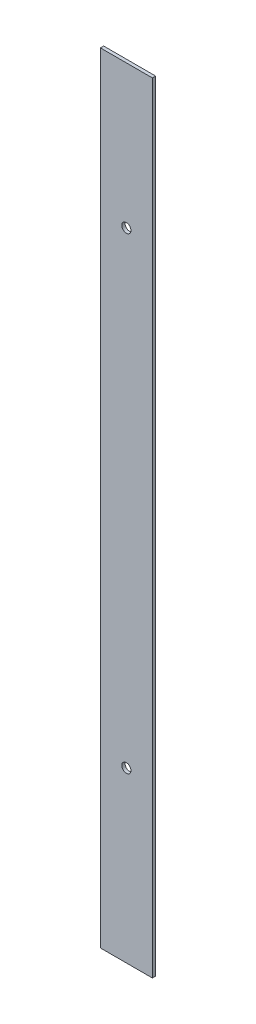
ISO-10303-21;
HEADER;
FILE_DESCRIPTION(('STEP AP214'),'2;1');
FILE_NAME('part.step','',(''),(''),'','','');
FILE_SCHEMA(('AUTOMOTIVE_DESIGN { 1 0 10303 214 1 1 1 1 }'));
ENDSEC;
DATA;
#1=APPLICATION_CONTEXT('core data for automotive mechanical design processes');
#2=APPLICATION_PROTOCOL_DEFINITION('international standard','automotive_design',2000,#1);
#3=PRODUCT_CONTEXT('',#1,'mechanical');
#4=PRODUCT('Part','Part','',(#3));
#5=PRODUCT_RELATED_PRODUCT_CATEGORY('part','',(#4));
#6=PRODUCT_DEFINITION_FORMATION('','',#4);
#7=PRODUCT_DEFINITION_CONTEXT('part definition',#1,'design');
#8=PRODUCT_DEFINITION('design','',#6,#7);
#9=PRODUCT_DEFINITION_SHAPE('','',#8);
#10=(LENGTH_UNIT() NAMED_UNIT(*) SI_UNIT(.MILLI.,.METRE.));
#11=(NAMED_UNIT(*) PLANE_ANGLE_UNIT() SI_UNIT($,.RADIAN.));
#12=(NAMED_UNIT(*) SI_UNIT($,.STERADIAN.) SOLID_ANGLE_UNIT());
#13=UNCERTAINTY_MEASURE_WITH_UNIT(LENGTH_MEASURE(1.E-05),#10,'distance_accuracy_value','');
#14=(GEOMETRIC_REPRESENTATION_CONTEXT(3) GLOBAL_UNCERTAINTY_ASSIGNED_CONTEXT((#13)) GLOBAL_UNIT_ASSIGNED_CONTEXT((#10,
#11,#12)) REPRESENTATION_CONTEXT('',''));
#15=CARTESIAN_POINT('',(0.,0.,0.));
#16=DIRECTION('',(0.,0.,1.));
#17=DIRECTION('',(1.,0.,0.));
#18=AXIS2_PLACEMENT_3D('',#15,#16,#17);
#19=CARTESIAN_POINT('',(0.,0.,1.5875));
#20=DIRECTION('',(0.,0.,-1.));
#21=DIRECTION('',(-1.,0.,0.));
#22=AXIS2_PLACEMENT_3D('',#19,#20,#21);
#23=PLANE('',#22);
#24=DIRECTION('',(0.,-1.,0.));
#25=VECTOR('',#24,1.);
#26=CARTESIAN_POINT('',(0.,0.,1.5875));
#27=LINE('',#26,#25);
#28=CARTESIAN_POINT('',(0.,381.,1.5875));
#29=VERTEX_POINT('',#28);
#30=CARTESIAN_POINT('',(0.,0.,1.5875));
#31=VERTEX_POINT('',#30);
#32=EDGE_CURVE('E92',#29,#31,#27,.T.);
#33=ORIENTED_EDGE('',*,*,#32,.T.);
#34=DIRECTION('',(1.,0.,0.));
#35=VECTOR('',#34,1.);
#36=CARTESIAN_POINT('',(0.,0.,1.5875));
#37=LINE('',#36,#35);
#38=CARTESIAN_POINT('',(25.4,0.,1.5875));
#39=VERTEX_POINT('',#38);
#40=EDGE_CURVE('E87',#31,#39,#37,.T.);
#41=ORIENTED_EDGE('',*,*,#40,.T.);
#42=DIRECTION('',(0.,1.,0.));
#43=VECTOR('',#42,1.);
#44=CARTESIAN_POINT('',(25.4,0.,1.5875));
#45=LINE('',#44,#43);
#46=CARTESIAN_POINT('',(25.4,381.,1.5875));
#47=VERTEX_POINT('',#46);
#48=EDGE_CURVE('E90',#39,#47,#45,.T.);
#49=ORIENTED_EDGE('',*,*,#48,.T.);
#50=DIRECTION('',(-1.,0.,0.));
#51=VECTOR('',#50,1.);
#52=CARTESIAN_POINT('',(0.,381.,1.5875));
#53=LINE('',#52,#51);
#54=EDGE_CURVE('E57',#47,#29,#53,.T.);
#55=ORIENTED_EDGE('',*,*,#54,.T.);
#56=EDGE_LOOP('',(#33,#41,#49,#55));
#57=FACE_BOUND('',#56,.T.);
#58=CARTESIAN_POINT('',(12.7,82.55,1.5875));
#59=DIRECTION('',(0.,0.,1.));
#60=DIRECTION('',(1.,0.,0.));
#61=AXIS2_PLACEMENT_3D('',#58,#59,#60);
#62=CIRCLE('',#61,2.25);
#63=CARTESIAN_POINT('',(14.95,82.55,1.5875));
#64=VERTEX_POINT('',#63);
#65=EDGE_CURVE('E112',#64,#64,#62,.T.);
#66=ORIENTED_EDGE('',*,*,#65,.F.);
#67=EDGE_LOOP('',(#66));
#68=FACE_BOUND('',#67,.T.);
#69=CARTESIAN_POINT('',(12.7,311.15,1.5875));
#70=DIRECTION('',(0.,0.,1.));
#71=DIRECTION('',(1.,0.,0.));
#72=AXIS2_PLACEMENT_3D('',#69,#70,#71);
#73=CIRCLE('',#72,2.25);
#74=CARTESIAN_POINT('',(14.95,311.15,1.5875));
#75=VERTEX_POINT('',#74);
#76=EDGE_CURVE('E134',#75,#75,#73,.T.);
#77=ORIENTED_EDGE('',*,*,#76,.F.);
#78=EDGE_LOOP('',(#77));
#79=FACE_BOUND('',#78,.T.);
#80=ADVANCED_FACE('F39',(#57,#68,#79),#23,.F.);
#81=CARTESIAN_POINT('',(0.,0.,0.));
#82=DIRECTION('',(0.,0.,-1.));
#83=DIRECTION('',(-1.,0.,0.));
#84=AXIS2_PLACEMENT_3D('',#81,#82,#83);
#85=PLANE('',#84);
#86=CARTESIAN_POINT('',(12.7,82.55,0.));
#87=DIRECTION('',(0.,0.,1.));
#88=DIRECTION('',(1.,0.,0.));
#89=AXIS2_PLACEMENT_3D('',#86,#87,#88);
#90=CIRCLE('',#89,2.25);
#91=CARTESIAN_POINT('',(14.95,82.55,0.));
#92=VERTEX_POINT('',#91);
#93=EDGE_CURVE('E130',#92,#92,#90,.T.);
#94=ORIENTED_EDGE('',*,*,#93,.T.);
#95=EDGE_LOOP('',(#94));
#96=FACE_BOUND('',#95,.T.);
#97=DIRECTION('',(0.,-1.,0.));
#98=VECTOR('',#97,1.);
#99=CARTESIAN_POINT('',(0.,0.,0.));
#100=LINE('',#99,#98);
#101=CARTESIAN_POINT('',(0.,381.,0.));
#102=VERTEX_POINT('',#101);
#103=CARTESIAN_POINT('',(0.,0.,0.));
#104=VERTEX_POINT('',#103);
#105=EDGE_CURVE('E108',#102,#104,#100,.T.);
#106=ORIENTED_EDGE('',*,*,#105,.F.);
#107=DIRECTION('',(-1.,0.,0.));
#108=VECTOR('',#107,1.);
#109=CARTESIAN_POINT('',(0.,381.,0.));
#110=LINE('',#109,#108);
#111=CARTESIAN_POINT('',(25.4,381.,0.));
#112=VERTEX_POINT('',#111);
#113=EDGE_CURVE('E80',#112,#102,#110,.T.);
#114=ORIENTED_EDGE('',*,*,#113,.F.);
#115=DIRECTION('',(0.,1.,0.));
#116=VECTOR('',#115,1.);
#117=CARTESIAN_POINT('',(25.4,0.,0.));
#118=LINE('',#117,#116);
#119=CARTESIAN_POINT('',(25.4,0.,0.));
#120=VERTEX_POINT('',#119);
#121=EDGE_CURVE('E74',#120,#112,#118,.T.);
#122=ORIENTED_EDGE('',*,*,#121,.F.);
#123=DIRECTION('',(1.,0.,0.));
#124=VECTOR('',#123,1.);
#125=CARTESIAN_POINT('',(0.,0.,0.));
#126=LINE('',#125,#124);
#127=EDGE_CURVE('E97',#104,#120,#126,.T.);
#128=ORIENTED_EDGE('',*,*,#127,.F.);
#129=EDGE_LOOP('',(#106,#114,#122,#128));
#130=FACE_BOUND('',#129,.T.);
#131=CARTESIAN_POINT('',(12.7,311.15,0.));
#132=DIRECTION('',(0.,0.,1.));
#133=DIRECTION('',(1.,0.,0.));
#134=AXIS2_PLACEMENT_3D('',#131,#132,#133);
#135=CIRCLE('',#134,2.25);
#136=CARTESIAN_POINT('',(14.95,311.15,0.));
#137=VERTEX_POINT('',#136);
#138=EDGE_CURVE('E138',#137,#137,#135,.T.);
#139=ORIENTED_EDGE('',*,*,#138,.T.);
#140=EDGE_LOOP('',(#139));
#141=FACE_BOUND('',#140,.T.);
#142=ADVANCED_FACE('F125',(#96,#130,#141),#85,.T.);
#143=CARTESIAN_POINT('',(0.,0.,1.5875));
#144=DIRECTION('',(1.,0.,0.));
#145=DIRECTION('',(0.,0.,-1.));
#146=AXIS2_PLACEMENT_3D('',#143,#144,#145);
#147=PLANE('',#146);
#148=ORIENTED_EDGE('',*,*,#105,.T.);
#149=DIRECTION('',(0.,0.,-1.));
#150=VECTOR('',#149,1.);
#151=CARTESIAN_POINT('',(0.,0.,1.5875));
#152=LINE('',#151,#150);
#153=EDGE_CURVE('E11',#31,#104,#152,.T.);
#154=ORIENTED_EDGE('',*,*,#153,.F.);
#155=ORIENTED_EDGE('',*,*,#32,.F.);
#156=DIRECTION('',(0.,0.,-1.));
#157=VECTOR('',#156,1.);
#158=CARTESIAN_POINT('',(0.,381.,1.5875));
#159=LINE('',#158,#157);
#160=EDGE_CURVE('E104',#29,#102,#159,.T.);
#161=ORIENTED_EDGE('',*,*,#160,.T.);
#162=EDGE_LOOP('',(#148,#154,#155,#161));
#163=FACE_BOUND('',#162,.T.);
#164=ADVANCED_FACE('F41',(#163),#147,.F.);
#165=CARTESIAN_POINT('',(0.,0.,1.5875));
#166=DIRECTION('',(0.,1.,0.));
#167=DIRECTION('',(0.,0.,1.));
#168=AXIS2_PLACEMENT_3D('',#165,#166,#167);
#169=PLANE('',#168);
#170=ORIENTED_EDGE('',*,*,#127,.T.);
#171=DIRECTION('',(0.,0.,-1.));
#172=VECTOR('',#171,1.);
#173=CARTESIAN_POINT('',(25.4,0.,1.5875));
#174=LINE('',#173,#172);
#175=EDGE_CURVE('E49',#39,#120,#174,.T.);
#176=ORIENTED_EDGE('',*,*,#175,.F.);
#177=ORIENTED_EDGE('',*,*,#40,.F.);
#178=ORIENTED_EDGE('',*,*,#153,.T.);
#179=EDGE_LOOP('',(#170,#176,#177,#178));
#180=FACE_BOUND('',#179,.T.);
#181=ADVANCED_FACE('F96',(#180),#169,.F.);
#182=CARTESIAN_POINT('',(25.4,0.,1.5875));
#183=DIRECTION('',(-1.,0.,0.));
#184=DIRECTION('',(0.,0.,1.));
#185=AXIS2_PLACEMENT_3D('',#182,#183,#184);
#186=PLANE('',#185);
#187=ORIENTED_EDGE('',*,*,#121,.T.);
#188=DIRECTION('',(0.,0.,-1.));
#189=VECTOR('',#188,1.);
#190=CARTESIAN_POINT('',(25.4,381.,1.5875));
#191=LINE('',#190,#189);
#192=EDGE_CURVE('E99',#47,#112,#191,.T.);
#193=ORIENTED_EDGE('',*,*,#192,.F.);
#194=ORIENTED_EDGE('',*,*,#48,.F.);
#195=ORIENTED_EDGE('',*,*,#175,.T.);
#196=EDGE_LOOP('',(#187,#193,#194,#195));
#197=FACE_BOUND('',#196,.T.);
#198=ADVANCED_FACE('F100',(#197),#186,.F.);
#199=CARTESIAN_POINT('',(0.,381.,1.5875));
#200=DIRECTION('',(0.,-1.,0.));
#201=DIRECTION('',(0.,0.,-1.));
#202=AXIS2_PLACEMENT_3D('',#199,#200,#201);
#203=PLANE('',#202);
#204=ORIENTED_EDGE('',*,*,#113,.T.);
#205=ORIENTED_EDGE('',*,*,#160,.F.);
#206=ORIENTED_EDGE('',*,*,#54,.F.);
#207=ORIENTED_EDGE('',*,*,#192,.T.);
#208=EDGE_LOOP('',(#204,#205,#206,#207));
#209=FACE_BOUND('',#208,.T.);
#210=ADVANCED_FACE('F122',(#209),#203,.F.);
#211=CARTESIAN_POINT('',(12.7,82.55,1.5875));
#212=DIRECTION('',(0.,0.,-1.));
#213=DIRECTION('',(-1.,0.,0.));
#214=AXIS2_PLACEMENT_3D('',#211,#212,#213);
#215=CYLINDRICAL_SURFACE('',#214,2.25);
#216=ORIENTED_EDGE('',*,*,#65,.T.);
#217=EDGE_LOOP('',(#216));
#218=FACE_BOUND('',#217,.T.);
#219=ORIENTED_EDGE('',*,*,#93,.F.);
#220=EDGE_LOOP('',(#219));
#221=FACE_BOUND('',#220,.T.);
#222=ADVANCED_FACE('F157',(#218,#221),#215,.F.);
#223=CARTESIAN_POINT('',(12.7,311.15,1.5875));
#224=DIRECTION('',(0.,0.,-1.));
#225=DIRECTION('',(-1.,0.,0.));
#226=AXIS2_PLACEMENT_3D('',#223,#224,#225);
#227=CYLINDRICAL_SURFACE('',#226,2.25);
#228=ORIENTED_EDGE('',*,*,#76,.T.);
#229=EDGE_LOOP('',(#228));
#230=FACE_BOUND('',#229,.T.);
#231=ORIENTED_EDGE('',*,*,#138,.F.);
#232=EDGE_LOOP('',(#231));
#233=FACE_BOUND('',#232,.T.);
#234=ADVANCED_FACE('F146',(#230,#233),#227,.F.);
#235=CLOSED_SHELL('',(#80,#142,#164,#181,#198,#210,#222,#234));
#236=MANIFOLD_SOLID_BREP('B2',#235);
#237=ADVANCED_BREP_SHAPE_REPRESENTATION('',(#18,#236),#14);
#238=SHAPE_DEFINITION_REPRESENTATION(#9,#237);
ENDSEC;
END-ISO-10303-21;
